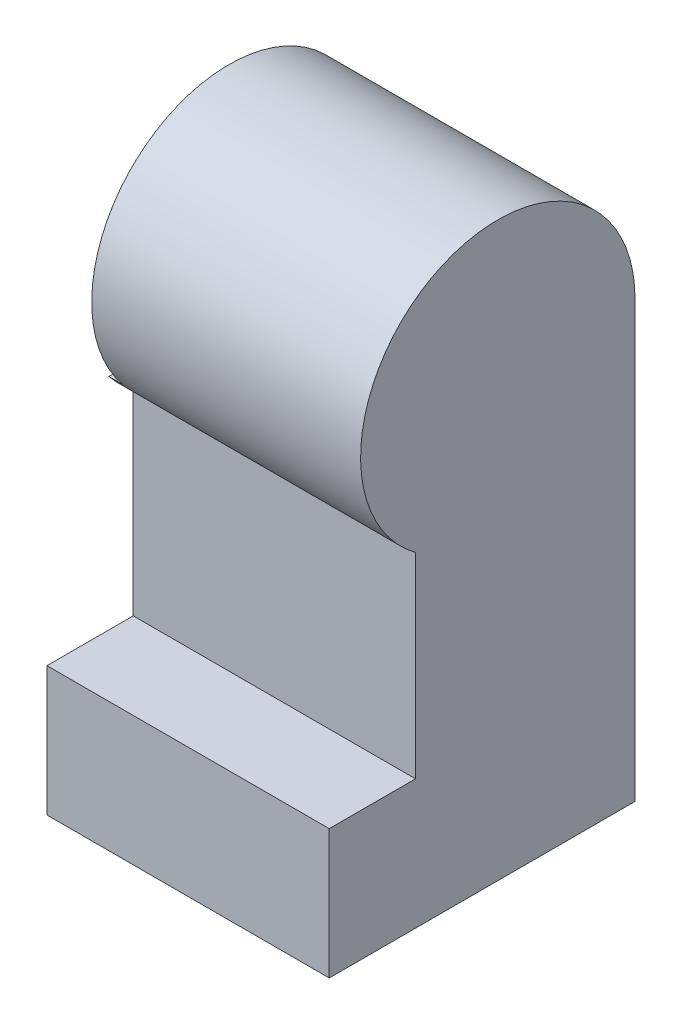
ISO-10303-21;
HEADER;
FILE_DESCRIPTION(('STEP AP214'),'2;1');
FILE_NAME('part.step','',(''),(''),'','','');
FILE_SCHEMA(('AUTOMOTIVE_DESIGN { 1 0 10303 214 1 1 1 1 }'));
ENDSEC;
DATA;
#1=APPLICATION_CONTEXT('core data for automotive mechanical design processes');
#2=APPLICATION_PROTOCOL_DEFINITION('international standard','automotive_design',2000,#1);
#3=PRODUCT_CONTEXT('',#1,'mechanical');
#4=PRODUCT('Part','Part','',(#3));
#5=PRODUCT_RELATED_PRODUCT_CATEGORY('part','',(#4));
#6=PRODUCT_DEFINITION_FORMATION('','',#4);
#7=PRODUCT_DEFINITION_CONTEXT('part definition',#1,'design');
#8=PRODUCT_DEFINITION('design','',#6,#7);
#9=PRODUCT_DEFINITION_SHAPE('','',#8);
#10=(LENGTH_UNIT() NAMED_UNIT(*) SI_UNIT(.MILLI.,.METRE.));
#11=(NAMED_UNIT(*) PLANE_ANGLE_UNIT() SI_UNIT($,.RADIAN.));
#12=(NAMED_UNIT(*) SI_UNIT($,.STERADIAN.) SOLID_ANGLE_UNIT());
#13=UNCERTAINTY_MEASURE_WITH_UNIT(LENGTH_MEASURE(1.E-05),#10,'distance_accuracy_value','');
#14=(GEOMETRIC_REPRESENTATION_CONTEXT(3) GLOBAL_UNCERTAINTY_ASSIGNED_CONTEXT((#13)) GLOBAL_UNIT_ASSIGNED_CONTEXT((#10,
#11,#12)) REPRESENTATION_CONTEXT('',''));
#15=CARTESIAN_POINT('',(0.,0.,0.));
#16=DIRECTION('',(0.,0.,1.));
#17=DIRECTION('',(1.,0.,0.));
#18=AXIS2_PLACEMENT_3D('',#15,#16,#17);
#19=CARTESIAN_POINT('',(10.8,11.4,-1.19999999999999));
#20=DIRECTION('',(-1.,0.,0.));
#21=DIRECTION('',(0.,0.,1.));
#22=AXIS2_PLACEMENT_3D('',#19,#20,#21);
#23=CYLINDRICAL_SURFACE('',#22,10.5);
#24=DIRECTION('',(-1.,0.,0.));
#25=VECTOR('',#24,1.);
#26=CARTESIAN_POINT('',(10.8,11.4,-11.7));
#27=LINE('',#26,#25);
#28=CARTESIAN_POINT('',(10.8,11.4,-11.7));
#29=VERTEX_POINT('',#28);
#30=CARTESIAN_POINT('',(-9.77499999999998,11.4,-11.7));
#31=VERTEX_POINT('',#30);
#32=EDGE_CURVE('E136',#29,#31,#27,.T.);
#33=ORIENTED_EDGE('',*,*,#32,.T.);
#34=CARTESIAN_POINT('',(-9.77499999999999,11.4,-1.19999999999999));
#35=DIRECTION('',(1.,0.,0.));
#36=DIRECTION('',(0.,1.,0.));
#37=AXIS2_PLACEMENT_3D('',#34,#35,#36);
#38=CIRCLE('',#37,10.5);
#39=CARTESIAN_POINT('',(-9.77499999999998,4.8,6.96639455328972));
#40=VERTEX_POINT('',#39);
#41=EDGE_CURVE('E144',#31,#40,#38,.T.);
#42=ORIENTED_EDGE('',*,*,#41,.T.);
#43=DIRECTION('',(-1.,0.,0.));
#44=VECTOR('',#43,1.);
#45=CARTESIAN_POINT('',(10.8,4.8,6.96639455328973));
#46=LINE('',#45,#44);
#47=CARTESIAN_POINT('',(-10.8,4.8,6.96639455328973));
#48=VERTEX_POINT('',#47);
#49=EDGE_CURVE('E196',#40,#48,#46,.T.);
#50=ORIENTED_EDGE('',*,*,#49,.T.);
#51=CARTESIAN_POINT('',(-10.8,11.4,-1.19999999999999));
#52=DIRECTION('',(1.,0.,0.));
#53=DIRECTION('',(0.,0.,-1.));
#54=AXIS2_PLACEMENT_3D('',#51,#52,#53);
#55=CIRCLE('',#54,10.5);
#56=CARTESIAN_POINT('',(-10.8,2.99999999999999,5.10000000000001));
#57=VERTEX_POINT('',#56);
#58=EDGE_CURVE('E140',#48,#57,#55,.T.);
#59=ORIENTED_EDGE('',*,*,#58,.T.);
#60=DIRECTION('',(-1.,0.,0.));
#61=VECTOR('',#60,1.);
#62=CARTESIAN_POINT('',(10.8,2.99999999999999,5.10000000000001));
#63=LINE('',#62,#61);
#64=CARTESIAN_POINT('',(10.8,2.99999999999999,5.10000000000001));
#65=VERTEX_POINT('',#64);
#66=EDGE_CURVE('E11',#65,#57,#63,.T.);
#67=ORIENTED_EDGE('',*,*,#66,.F.);
#68=CARTESIAN_POINT('',(10.8,11.4,-1.19999999999999));
#69=DIRECTION('',(1.,0.,0.));
#70=DIRECTION('',(0.,0.,-1.));
#71=AXIS2_PLACEMENT_3D('',#68,#69,#70);
#72=CIRCLE('',#71,10.5);
#73=EDGE_CURVE('E158',#29,#65,#72,.T.);
#74=ORIENTED_EDGE('',*,*,#73,.F.);
#75=EDGE_LOOP('',(#33,#42,#50,#59,#67,#74));
#76=FACE_BOUND('',#75,.T.);
#77=ADVANCED_FACE('F45',(#76),#23,.T.);
#78=CARTESIAN_POINT('',(10.8,-12.,5.10000000000001));
#79=DIRECTION('',(0.,0.,-1.));
#80=DIRECTION('',(-1.,0.,0.));
#81=AXIS2_PLACEMENT_3D('',#78,#79,#80);
#82=PLANE('',#81);
#83=DIRECTION('',(0.,-1.,0.));
#84=VECTOR('',#83,1.);
#85=CARTESIAN_POINT('',(-10.8,-12.,5.10000000000001));
#86=LINE('',#85,#84);
#87=CARTESIAN_POINT('',(-10.8,-12.,5.10000000000001));
#88=VERTEX_POINT('',#87);
#89=EDGE_CURVE('E143',#57,#88,#86,.T.);
#90=ORIENTED_EDGE('',*,*,#89,.T.);
#91=DIRECTION('',(-1.,0.,0.));
#92=VECTOR('',#91,1.);
#93=CARTESIAN_POINT('',(10.8,-12.,5.10000000000001));
#94=LINE('',#93,#92);
#95=CARTESIAN_POINT('',(10.8,-12.,5.10000000000001));
#96=VERTEX_POINT('',#95);
#97=EDGE_CURVE('E54',#96,#88,#94,.T.);
#98=ORIENTED_EDGE('',*,*,#97,.F.);
#99=DIRECTION('',(0.,-1.,0.));
#100=VECTOR('',#99,1.);
#101=CARTESIAN_POINT('',(10.8,-12.,5.10000000000001));
#102=LINE('',#101,#100);
#103=EDGE_CURVE('E103',#65,#96,#102,.T.);
#104=ORIENTED_EDGE('',*,*,#103,.F.);
#105=ORIENTED_EDGE('',*,*,#66,.T.);
#106=EDGE_LOOP('',(#90,#98,#104,#105));
#107=FACE_BOUND('',#106,.T.);
#108=ADVANCED_FACE('F242',(#107),#82,.F.);
#109=CARTESIAN_POINT('',(10.8,-12.,11.7));
#110=DIRECTION('',(0.,-1.,0.));
#111=DIRECTION('',(0.,0.,-1.));
#112=AXIS2_PLACEMENT_3D('',#109,#110,#111);
#113=PLANE('',#112);
#114=DIRECTION('',(0.,0.,1.));
#115=VECTOR('',#114,1.);
#116=CARTESIAN_POINT('',(-10.8,-12.,11.7));
#117=LINE('',#116,#115);
#118=CARTESIAN_POINT('',(-10.8,-12.,11.7));
#119=VERTEX_POINT('',#118);
#120=EDGE_CURVE('E147',#88,#119,#117,.T.);
#121=ORIENTED_EDGE('',*,*,#120,.T.);
#122=DIRECTION('',(-1.,0.,0.));
#123=VECTOR('',#122,1.);
#124=CARTESIAN_POINT('',(10.8,-12.,11.7));
#125=LINE('',#124,#123);
#126=CARTESIAN_POINT('',(10.8,-12.,11.7));
#127=VERTEX_POINT('',#126);
#128=EDGE_CURVE('E129',#127,#119,#125,.T.);
#129=ORIENTED_EDGE('',*,*,#128,.F.);
#130=DIRECTION('',(0.,0.,1.));
#131=VECTOR('',#130,1.);
#132=CARTESIAN_POINT('',(10.8,-12.,11.7));
#133=LINE('',#132,#131);
#134=EDGE_CURVE('E118',#96,#127,#133,.T.);
#135=ORIENTED_EDGE('',*,*,#134,.F.);
#136=ORIENTED_EDGE('',*,*,#97,.T.);
#137=EDGE_LOOP('',(#121,#129,#135,#136));
#138=FACE_BOUND('',#137,.T.);
#139=ADVANCED_FACE('F170',(#138),#113,.F.);
#140=CARTESIAN_POINT('',(10.8,-21.9,11.7));
#141=DIRECTION('',(0.,0.,-1.));
#142=DIRECTION('',(-1.,0.,0.));
#143=AXIS2_PLACEMENT_3D('',#140,#141,#142);
#144=PLANE('',#143);
#145=DIRECTION('',(0.,-1.,0.));
#146=VECTOR('',#145,1.);
#147=CARTESIAN_POINT('',(-10.8,-21.9,11.7));
#148=LINE('',#147,#146);
#149=CARTESIAN_POINT('',(-10.8,-21.9,11.7));
#150=VERTEX_POINT('',#149);
#151=EDGE_CURVE('E127',#119,#150,#148,.T.);
#152=ORIENTED_EDGE('',*,*,#151,.T.);
#153=DIRECTION('',(-1.,0.,0.));
#154=VECTOR('',#153,1.);
#155=CARTESIAN_POINT('',(10.8,-21.9,11.7));
#156=LINE('',#155,#154);
#157=CARTESIAN_POINT('',(10.8,-21.9,11.7));
#158=VERTEX_POINT('',#157);
#159=EDGE_CURVE('E124',#158,#150,#156,.T.);
#160=ORIENTED_EDGE('',*,*,#159,.F.);
#161=DIRECTION('',(0.,-1.,0.));
#162=VECTOR('',#161,1.);
#163=CARTESIAN_POINT('',(10.8,-21.9,11.7));
#164=LINE('',#163,#162);
#165=EDGE_CURVE('E112',#127,#158,#164,.T.);
#166=ORIENTED_EDGE('',*,*,#165,.F.);
#167=ORIENTED_EDGE('',*,*,#128,.T.);
#168=EDGE_LOOP('',(#152,#160,#166,#167));
#169=FACE_BOUND('',#168,.T.);
#170=ADVANCED_FACE('F125',(#169),#144,.F.);
#171=CARTESIAN_POINT('',(10.8,-21.9,-11.7));
#172=DIRECTION('',(0.,1.,0.));
#173=DIRECTION('',(0.,0.,1.));
#174=AXIS2_PLACEMENT_3D('',#171,#172,#173);
#175=PLANE('',#174);
#176=DIRECTION('',(0.,0.,-1.));
#177=VECTOR('',#176,1.);
#178=CARTESIAN_POINT('',(-10.8,-21.9,-11.7));
#179=LINE('',#178,#177);
#180=CARTESIAN_POINT('',(-10.8,-21.9,-11.7));
#181=VERTEX_POINT('',#180);
#182=EDGE_CURVE('E95',#150,#181,#179,.T.);
#183=ORIENTED_EDGE('',*,*,#182,.T.);
#184=DIRECTION('',(-1.,0.,0.));
#185=VECTOR('',#184,1.);
#186=CARTESIAN_POINT('',(10.8,-21.9,-11.7));
#187=LINE('',#186,#185);
#188=CARTESIAN_POINT('',(10.8,-21.9,-11.7));
#189=VERTEX_POINT('',#188);
#190=EDGE_CURVE('E130',#189,#181,#187,.T.);
#191=ORIENTED_EDGE('',*,*,#190,.F.);
#192=DIRECTION('',(0.,0.,-1.));
#193=VECTOR('',#192,1.);
#194=CARTESIAN_POINT('',(10.8,-21.9,-11.7));
#195=LINE('',#194,#193);
#196=EDGE_CURVE('E116',#158,#189,#195,.T.);
#197=ORIENTED_EDGE('',*,*,#196,.F.);
#198=ORIENTED_EDGE('',*,*,#159,.T.);
#199=EDGE_LOOP('',(#183,#191,#197,#198));
#200=FACE_BOUND('',#199,.T.);
#201=ADVANCED_FACE('F132',(#200),#175,.F.);
#202=CARTESIAN_POINT('',(10.8,11.4,-11.7));
#203=DIRECTION('',(0.,0.,1.));
#204=DIRECTION('',(0.,-1.,0.));
#205=AXIS2_PLACEMENT_3D('',#202,#203,#204);
#206=PLANE('',#205);
#207=DIRECTION('',(1.,0.,0.));
#208=VECTOR('',#207,1.);
#209=CARTESIAN_POINT('',(-10.8,4.8,-11.7));
#210=LINE('',#209,#208);
#211=CARTESIAN_POINT('',(-10.8,4.8,-11.7));
#212=VERTEX_POINT('',#211);
#213=CARTESIAN_POINT('',(-9.77499999999998,4.8,-11.7));
#214=VERTEX_POINT('',#213);
#215=EDGE_CURVE('E61',#212,#214,#210,.T.);
#216=ORIENTED_EDGE('',*,*,#215,.T.);
#217=DIRECTION('',(0.,1.,0.));
#218=VECTOR('',#217,1.);
#219=CARTESIAN_POINT('',(-9.77499999999999,21.9,-11.7));
#220=LINE('',#219,#218);
#221=EDGE_CURVE('E184',#214,#31,#220,.T.);
#222=ORIENTED_EDGE('',*,*,#221,.T.);
#223=ORIENTED_EDGE('',*,*,#32,.F.);
#224=DIRECTION('',(0.,1.,0.));
#225=VECTOR('',#224,1.);
#226=CARTESIAN_POINT('',(10.8,11.4,-11.7));
#227=LINE('',#226,#225);
#228=EDGE_CURVE('E70',#189,#29,#227,.T.);
#229=ORIENTED_EDGE('',*,*,#228,.F.);
#230=ORIENTED_EDGE('',*,*,#190,.T.);
#231=DIRECTION('',(0.,1.,0.));
#232=VECTOR('',#231,1.);
#233=CARTESIAN_POINT('',(-10.8,11.4,-11.7));
#234=LINE('',#233,#232);
#235=EDGE_CURVE('E154',#181,#212,#234,.T.);
#236=ORIENTED_EDGE('',*,*,#235,.T.);
#237=EDGE_LOOP('',(#216,#222,#223,#229,#230,#236));
#238=FACE_BOUND('',#237,.T.);
#239=ADVANCED_FACE('F178',(#238),#206,.F.);
#240=CARTESIAN_POINT('',(10.8,11.4,-1.19999999999999));
#241=DIRECTION('',(1.,0.,0.));
#242=DIRECTION('',(0.,0.,-1.));
#243=AXIS2_PLACEMENT_3D('',#240,#241,#242);
#244=PLANE('',#243);
#245=ORIENTED_EDGE('',*,*,#73,.T.);
#246=ORIENTED_EDGE('',*,*,#103,.T.);
#247=ORIENTED_EDGE('',*,*,#134,.T.);
#248=ORIENTED_EDGE('',*,*,#165,.T.);
#249=ORIENTED_EDGE('',*,*,#196,.T.);
#250=ORIENTED_EDGE('',*,*,#228,.T.);
#251=EDGE_LOOP('',(#245,#246,#247,#248,#249,#250));
#252=FACE_BOUND('',#251,.T.);
#253=ADVANCED_FACE('F114',(#252),#244,.T.);
#254=CARTESIAN_POINT('',(-10.8,11.4,-1.19999999999999));
#255=DIRECTION('',(1.,0.,0.));
#256=DIRECTION('',(0.,0.,-1.));
#257=AXIS2_PLACEMENT_3D('',#254,#255,#256);
#258=PLANE('',#257);
#259=ORIENTED_EDGE('',*,*,#58,.F.);
#260=DIRECTION('',(0.,0.,1.));
#261=VECTOR('',#260,1.);
#262=CARTESIAN_POINT('',(-10.8,4.8,-11.7));
#263=LINE('',#262,#261);
#264=EDGE_CURVE('E176',#212,#48,#263,.T.);
#265=ORIENTED_EDGE('',*,*,#264,.F.);
#266=ORIENTED_EDGE('',*,*,#235,.F.);
#267=ORIENTED_EDGE('',*,*,#182,.F.);
#268=ORIENTED_EDGE('',*,*,#151,.F.);
#269=ORIENTED_EDGE('',*,*,#120,.F.);
#270=ORIENTED_EDGE('',*,*,#89,.F.);
#271=EDGE_LOOP('',(#259,#265,#266,#267,#268,#269,#270));
#272=FACE_BOUND('',#271,.T.);
#273=ADVANCED_FACE('F174',(#272),#258,.F.);
#274=CARTESIAN_POINT('',(-9.77499999999999,21.9,-11.7));
#275=DIRECTION('',(1.,0.,0.));
#276=DIRECTION('',(0.,1.,0.));
#277=AXIS2_PLACEMENT_3D('',#274,#275,#276);
#278=PLANE('',#277);
#279=CARTESIAN_POINT('',(-9.77499999999998,13.35,0.));
#280=DIRECTION('',(1.,0.,0.));
#281=DIRECTION('',(0.,1.,0.));
#282=AXIS2_PLACEMENT_3D('',#279,#280,#281);
#283=CIRCLE('',#282,3.);
#284=CARTESIAN_POINT('',(-9.77499999999998,16.35,0.));
#285=VERTEX_POINT('',#284);
#286=EDGE_CURVE('E48',#285,#285,#283,.F.);
#287=ORIENTED_EDGE('',*,*,#286,.F.);
#288=EDGE_LOOP('',(#287));
#289=FACE_BOUND('',#288,.T.);
#290=ORIENTED_EDGE('',*,*,#41,.F.);
#291=ORIENTED_EDGE('',*,*,#221,.F.);
#292=DIRECTION('',(0.,0.,1.));
#293=VECTOR('',#292,1.);
#294=CARTESIAN_POINT('',(-9.77499999999998,4.8,-11.7));
#295=LINE('',#294,#293);
#296=EDGE_CURVE('E200',#214,#40,#295,.T.);
#297=ORIENTED_EDGE('',*,*,#296,.T.);
#298=EDGE_LOOP('',(#290,#291,#297));
#299=FACE_BOUND('',#298,.T.);
#300=ADVANCED_FACE('F221',(#289,#299),#278,.F.);
#301=CARTESIAN_POINT('',(-10.8,4.8,-11.7));
#302=DIRECTION('',(0.,-1.,0.));
#303=DIRECTION('',(0.,0.,-1.));
#304=AXIS2_PLACEMENT_3D('',#301,#302,#303);
#305=PLANE('',#304);
#306=ORIENTED_EDGE('',*,*,#296,.F.);
#307=ORIENTED_EDGE('',*,*,#215,.F.);
#308=ORIENTED_EDGE('',*,*,#264,.T.);
#309=ORIENTED_EDGE('',*,*,#49,.F.);
#310=EDGE_LOOP('',(#306,#307,#308,#309));
#311=FACE_BOUND('',#310,.T.);
#312=ADVANCED_FACE('F224',(#311),#305,.F.);
#313=CARTESIAN_POINT('',(-10.8,13.35,0.));
#314=DIRECTION('',(1.,0.,0.));
#315=DIRECTION('',(0.,1.,0.));
#316=AXIS2_PLACEMENT_3D('',#313,#314,#315);
#317=CYLINDRICAL_SURFACE('',#316,3.);
#318=CARTESIAN_POINT('',(-4.37499999999999,13.35,0.));
#319=DIRECTION('',(-1.,0.,0.));
#320=DIRECTION('',(0.,-1.,0.));
#321=AXIS2_PLACEMENT_3D('',#318,#319,#320);
#322=CIRCLE('',#321,3.);
#323=CARTESIAN_POINT('',(-4.37499999999999,10.35,0.));
#324=VERTEX_POINT('',#323);
#325=EDGE_CURVE('E210',#324,#324,#322,.T.);
#326=ORIENTED_EDGE('',*,*,#325,.F.);
#327=EDGE_LOOP('',(#326));
#328=FACE_BOUND('',#327,.T.);
#329=ORIENTED_EDGE('',*,*,#286,.T.);
#330=EDGE_LOOP('',(#329));
#331=FACE_BOUND('',#330,.T.);
#332=ADVANCED_FACE('F219',(#328,#331),#317,.F.);
#333=CARTESIAN_POINT('',(-4.37499999999999,13.35,0.));
#334=DIRECTION('',(-1.,0.,0.));
#335=DIRECTION('',(0.,-1.,0.));
#336=AXIS2_PLACEMENT_3D('',#333,#334,#335);
#337=PLANE('',#336);
#338=ORIENTED_EDGE('',*,*,#325,.T.);
#339=EDGE_LOOP('',(#338));
#340=FACE_BOUND('',#339,.T.);
#341=ADVANCED_FACE('F237',(#340),#337,.T.);
#342=CLOSED_SHELL('',(#77,#108,#139,#170,#201,#239,#253,#273,#300,#312,#332,#341));
#343=MANIFOLD_SOLID_BREP('B2',#342);
#344=ADVANCED_BREP_SHAPE_REPRESENTATION('',(#18,#343),#14);
#345=SHAPE_DEFINITION_REPRESENTATION(#9,#344);
ENDSEC;
END-ISO-10303-21;
